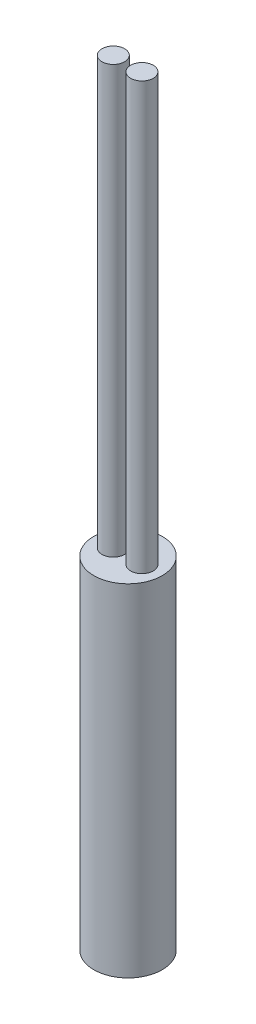
ISO-10303-21;
HEADER;
FILE_DESCRIPTION(('STEP AP214'),'2;1');
FILE_NAME('part.step','',(''),(''),'','','');
FILE_SCHEMA(('AUTOMOTIVE_DESIGN { 1 0 10303 214 1 1 1 1 }'));
ENDSEC;
DATA;
#1=APPLICATION_CONTEXT('core data for automotive mechanical design processes');
#2=APPLICATION_PROTOCOL_DEFINITION('international standard','automotive_design',2000,#1);
#3=PRODUCT_CONTEXT('',#1,'mechanical');
#4=PRODUCT('Part','Part','',(#3));
#5=PRODUCT_RELATED_PRODUCT_CATEGORY('part','',(#4));
#6=PRODUCT_DEFINITION_FORMATION('','',#4);
#7=PRODUCT_DEFINITION_CONTEXT('part definition',#1,'design');
#8=PRODUCT_DEFINITION('design','',#6,#7);
#9=PRODUCT_DEFINITION_SHAPE('','',#8);
#10=(LENGTH_UNIT() NAMED_UNIT(*) SI_UNIT(.MILLI.,.METRE.));
#11=(NAMED_UNIT(*) PLANE_ANGLE_UNIT() SI_UNIT($,.RADIAN.));
#12=(NAMED_UNIT(*) SI_UNIT($,.STERADIAN.) SOLID_ANGLE_UNIT());
#13=UNCERTAINTY_MEASURE_WITH_UNIT(LENGTH_MEASURE(1.E-05),#10,'distance_accuracy_value','');
#14=(GEOMETRIC_REPRESENTATION_CONTEXT(3) GLOBAL_UNCERTAINTY_ASSIGNED_CONTEXT((#13)) GLOBAL_UNIT_ASSIGNED_CONTEXT((#10,
#11,#12)) REPRESENTATION_CONTEXT('',''));
#15=CARTESIAN_POINT('',(0.,0.,0.));
#16=DIRECTION('',(0.,0.,1.));
#17=DIRECTION('',(1.,0.,0.));
#18=AXIS2_PLACEMENT_3D('',#15,#16,#17);
#19=CARTESIAN_POINT('',(0.,80.,0.));
#20=DIRECTION('',(0.,1.,0.));
#21=DIRECTION('',(0.,0.,1.));
#22=AXIS2_PLACEMENT_3D('',#19,#20,#21);
#23=PLANE('',#22);
#24=CARTESIAN_POINT('',(-3.35487727921084,80.,0.0901032740918996));
#25=DIRECTION('',(0.,1.,0.));
#26=DIRECTION('',(0.,0.,1.));
#27=AXIS2_PLACEMENT_3D('',#24,#25,#26);
#28=CIRCLE('',#27,2.64975220874494);
#29=CARTESIAN_POINT('',(-3.35487727921084,80.,-2.55964893465304));
#30=VERTEX_POINT('',#29);
#31=EDGE_CURVE('E10',#30,#30,#28,.T.);
#32=ORIENTED_EDGE('',*,*,#31,.F.);
#33=EDGE_LOOP('',(#32));
#34=FACE_BOUND('',#33,.T.);
#35=CARTESIAN_POINT('',(3.35487727921084,80.,0.0901032740918996));
#36=DIRECTION('',(0.,1.,0.));
#37=DIRECTION('',(0.,0.,1.));
#38=AXIS2_PLACEMENT_3D('',#35,#36,#37);
#39=CIRCLE('',#38,2.64975220874494);
#40=CARTESIAN_POINT('',(3.35487727921084,80.,-2.55964893465304));
#41=VERTEX_POINT('',#40);
#42=EDGE_CURVE('E60',#41,#41,#39,.T.);
#43=ORIENTED_EDGE('',*,*,#42,.F.);
#44=EDGE_LOOP('',(#43));
#45=FACE_BOUND('',#44,.T.);
#46=CARTESIAN_POINT('',(0.,80.,0.));
#47=DIRECTION('',(0.,1.,0.));
#48=DIRECTION('',(0.,0.,1.));
#49=AXIS2_PLACEMENT_3D('',#46,#47,#48);
#50=CIRCLE('',#49,8.);
#51=CARTESIAN_POINT('',(0.,80.,-8.));
#52=VERTEX_POINT('',#51);
#53=EDGE_CURVE('E65',#52,#52,#50,.T.);
#54=ORIENTED_EDGE('',*,*,#53,.T.);
#55=EDGE_LOOP('',(#54));
#56=FACE_BOUND('',#55,.T.);
#57=ADVANCED_FACE('F42',(#34,#45,#56),#23,.T.);
#58=CARTESIAN_POINT('',(-3.35487727921084,180.,0.0901032740918996));
#59=DIRECTION('',(0.,-1.,0.));
#60=DIRECTION('',(0.,0.,-1.));
#61=AXIS2_PLACEMENT_3D('',#58,#59,#60);
#62=CYLINDRICAL_SURFACE('',#61,2.64975220874494);
#63=CARTESIAN_POINT('',(-3.35487727921084,180.,0.0901032740918996));
#64=DIRECTION('',(0.,1.,0.));
#65=DIRECTION('',(0.,0.,1.));
#66=AXIS2_PLACEMENT_3D('',#63,#64,#65);
#67=CIRCLE('',#66,2.64975220874494);
#68=CARTESIAN_POINT('',(-3.35487727921084,180.,-2.55964893465304));
#69=VERTEX_POINT('',#68);
#70=EDGE_CURVE('E50',#69,#69,#67,.F.);
#71=CARTESIAN_POINT('',(-3.35487727921084,180.,-2.55964893465304));
#72=CARTESIAN_POINT('',(-3.35487727921084,178.958333333333,-2.55964893465304));
#73=CARTESIAN_POINT('',(-3.35487727921084,177.916666666667,-2.55964893465304));
#74=CARTESIAN_POINT('',(-3.35487727921084,175.833333333333,-2.55964893465304));
#75=CARTESIAN_POINT('',(-3.35487727921084,174.791666666667,-2.55964893465304));
#76=CARTESIAN_POINT('',(-3.35487727921084,172.708333333333,-2.55964893465304));
#77=CARTESIAN_POINT('',(-3.35487727921084,171.666666666667,-2.55964893465304));
#78=CARTESIAN_POINT('',(-3.35487727921084,169.583333333333,-2.55964893465304));
#79=CARTESIAN_POINT('',(-3.35487727921084,168.541666666667,-2.55964893465304));
#80=CARTESIAN_POINT('',(-3.35487727921084,166.458333333333,-2.55964893465304));
#81=CARTESIAN_POINT('',(-3.35487727921084,165.416666666667,-2.55964893465304));
#82=CARTESIAN_POINT('',(-3.35487727921084,163.333333333333,-2.55964893465304));
#83=CARTESIAN_POINT('',(-3.35487727921084,162.291666666667,-2.55964893465304));
#84=CARTESIAN_POINT('',(-3.35487727921084,160.208333333333,-2.55964893465304));
#85=CARTESIAN_POINT('',(-3.35487727921084,159.166666666667,-2.55964893465304));
#86=CARTESIAN_POINT('',(-3.35487727921084,157.083333333333,-2.55964893465304));
#87=CARTESIAN_POINT('',(-3.35487727921084,156.041666666667,-2.55964893465304));
#88=CARTESIAN_POINT('',(-3.35487727921084,153.958333333333,-2.55964893465304));
#89=CARTESIAN_POINT('',(-3.35487727921084,152.916666666667,-2.55964893465304));
#90=CARTESIAN_POINT('',(-3.35487727921084,150.833333333333,-2.55964893465304));
#91=CARTESIAN_POINT('',(-3.35487727921084,149.791666666667,-2.55964893465304));
#92=CARTESIAN_POINT('',(-3.35487727921084,147.708333333333,-2.55964893465304));
#93=CARTESIAN_POINT('',(-3.35487727921084,146.666666666667,-2.55964893465304));
#94=CARTESIAN_POINT('',(-3.35487727921084,144.583333333333,-2.55964893465304));
#95=CARTESIAN_POINT('',(-3.35487727921084,143.541666666667,-2.55964893465304));
#96=CARTESIAN_POINT('',(-3.35487727921084,141.458333333333,-2.55964893465304));
#97=CARTESIAN_POINT('',(-3.35487727921084,140.416666666667,-2.55964893465304));
#98=CARTESIAN_POINT('',(-3.35487727921084,138.333333333333,-2.55964893465304));
#99=CARTESIAN_POINT('',(-3.35487727921084,137.291666666667,-2.55964893465304));
#100=CARTESIAN_POINT('',(-3.35487727921084,135.208333333333,-2.55964893465304));
#101=CARTESIAN_POINT('',(-3.35487727921084,134.166666666667,-2.55964893465304));
#102=CARTESIAN_POINT('',(-3.35487727921084,132.083333333333,-2.55964893465304));
#103=CARTESIAN_POINT('',(-3.35487727921084,131.041666666667,-2.55964893465304));
#104=CARTESIAN_POINT('',(-3.35487727921084,128.958333333333,-2.55964893465304));
#105=CARTESIAN_POINT('',(-3.35487727921084,127.916666666667,-2.55964893465304));
#106=CARTESIAN_POINT('',(-3.35487727921084,125.833333333333,-2.55964893465304));
#107=CARTESIAN_POINT('',(-3.35487727921084,124.791666666667,-2.55964893465304));
#108=CARTESIAN_POINT('',(-3.35487727921084,122.708333333333,-2.55964893465304));
#109=CARTESIAN_POINT('',(-3.35487727921084,121.666666666667,-2.55964893465304));
#110=CARTESIAN_POINT('',(-3.35487727921084,119.583333333333,-2.55964893465304));
#111=CARTESIAN_POINT('',(-3.35487727921084,118.541666666667,-2.55964893465304));
#112=CARTESIAN_POINT('',(-3.35487727921084,116.458333333333,-2.55964893465304));
#113=CARTESIAN_POINT('',(-3.35487727921084,115.416666666667,-2.55964893465304));
#114=CARTESIAN_POINT('',(-3.35487727921084,113.333333333333,-2.55964893465304));
#115=CARTESIAN_POINT('',(-3.35487727921084,112.291666666667,-2.55964893465304));
#116=CARTESIAN_POINT('',(-3.35487727921084,110.208333333333,-2.55964893465304));
#117=CARTESIAN_POINT('',(-3.35487727921084,109.166666666667,-2.55964893465304));
#118=CARTESIAN_POINT('',(-3.35487727921084,107.083333333333,-2.55964893465304));
#119=CARTESIAN_POINT('',(-3.35487727921084,106.041666666667,-2.55964893465304));
#120=CARTESIAN_POINT('',(-3.35487727921084,103.958333333333,-2.55964893465304));
#121=CARTESIAN_POINT('',(-3.35487727921084,102.916666666667,-2.55964893465304));
#122=CARTESIAN_POINT('',(-3.35487727921084,100.833333333333,-2.55964893465304));
#123=CARTESIAN_POINT('',(-3.35487727921084,99.7916666666667,-2.55964893465304));
#124=CARTESIAN_POINT('',(-3.35487727921084,97.7083333333333,-2.55964893465304));
#125=CARTESIAN_POINT('',(-3.35487727921084,96.6666666666667,-2.55964893465304));
#126=CARTESIAN_POINT('',(-3.35487727921084,94.5833333333333,-2.55964893465304));
#127=CARTESIAN_POINT('',(-3.35487727921084,93.5416666666667,-2.55964893465304));
#128=CARTESIAN_POINT('',(-3.35487727921084,91.4583333333333,-2.55964893465304));
#129=CARTESIAN_POINT('',(-3.35487727921084,90.4166666666667,-2.55964893465304));
#130=CARTESIAN_POINT('',(-3.35487727921084,88.3333333333333,-2.55964893465304));
#131=CARTESIAN_POINT('',(-3.35487727921084,87.2916666666667,-2.55964893465304));
#132=CARTESIAN_POINT('',(-3.35487727921084,85.2083333333333,-2.55964893465304));
#133=CARTESIAN_POINT('',(-3.35487727921084,84.1666666666667,-2.55964893465304));
#134=CARTESIAN_POINT('',(-3.35487727921084,82.0833333333333,-2.55964893465304));
#135=CARTESIAN_POINT('',(-3.35487727921084,81.0416666666667,-2.55964893465304));
#136=CARTESIAN_POINT('',(-3.35487727921084,80.,-2.55964893465304));
#137=B_SPLINE_CURVE_WITH_KNOTS('',3,(#71,#72,#73,#74,#75,#76,#77,#78,#79,#80,#81,#82,#83,#84,
#85,#86,#87,#88,#89,#90,#91,#92,#93,#94,#95,#96,#97,#98,#99,#100,#101,#102,#103,#104,#105,#106,
#107,#108,#109,#110,#111,#112,#113,#114,#115,#116,#117,#118,#119,#120,#121,#122,#123,#124,#125,
#126,#127,#128,#129,#130,#131,#132,#133,#134,#135,#136),.UNSPECIFIED.,.F.,.F.,(4,2,2,2,2,2,2,2,
2,2,2,2,2,2,2,2,2,2,2,2,2,2,2,2,2,2,2,2,2,2,2,2,4),(0.,3.12500000000002,6.25000000000001,
9.37500000000002,12.5,15.625,18.75,21.875,25.,28.125,31.25,34.375,37.5,40.625,43.75,46.875,50.,
53.125,56.25,59.375,62.5,65.625,68.75,71.875,75.,78.125,81.25,84.375,87.5,90.625,93.75,96.875,
100.),.UNSPECIFIED.);
#138=EDGE_CURVE('BSEAM91',#69,#30,#137,.T.);
#139=ORIENTED_EDGE('',*,*,#70,.T.);
#140=ORIENTED_EDGE('',*,*,#31,.T.);
#141=ORIENTED_EDGE('',*,*,#138,.T.);
#142=ORIENTED_EDGE('',*,*,#138,.F.);
#143=EDGE_LOOP('',(#139,#141,#140,#142));
#144=FACE_BOUND('',#143,.T.);
#145=ADVANCED_FACE('F91',(#144),#62,.T.);
#146=CARTESIAN_POINT('',(0.,180.,0.));
#147=DIRECTION('',(0.,1.,0.));
#148=DIRECTION('',(0.,0.,1.));
#149=AXIS2_PLACEMENT_3D('',#146,#147,#148);
#150=PLANE('',#149);
#151=ORIENTED_EDGE('',*,*,#70,.F.);
#152=EDGE_LOOP('',(#151));
#153=FACE_BOUND('',#152,.T.);
#154=ADVANCED_FACE('F97',(#153),#150,.T.);
#155=CARTESIAN_POINT('',(3.35487727921084,180.,0.0901032740918996));
#156=DIRECTION('',(0.,-1.,0.));
#157=DIRECTION('',(0.,0.,-1.));
#158=AXIS2_PLACEMENT_3D('',#155,#156,#157);
#159=CYLINDRICAL_SURFACE('',#158,2.64975220874494);
#160=CARTESIAN_POINT('',(3.35487727921084,180.,0.0901032740918996));
#161=DIRECTION('',(0.,1.,0.));
#162=DIRECTION('',(0.,0.,1.));
#163=AXIS2_PLACEMENT_3D('',#160,#161,#162);
#164=CIRCLE('',#163,2.64975220874494);
#165=CARTESIAN_POINT('',(3.35487727921084,180.,-2.55964893465304));
#166=VERTEX_POINT('',#165);
#167=EDGE_CURVE('E55',#166,#166,#164,.T.);
#168=CARTESIAN_POINT('',(3.35487727921084,180.,-2.55964893465304));
#169=CARTESIAN_POINT('',(3.35487727921084,178.958333333333,-2.55964893465304));
#170=CARTESIAN_POINT('',(3.35487727921084,177.916666666667,-2.55964893465304));
#171=CARTESIAN_POINT('',(3.35487727921084,175.833333333333,-2.55964893465304));
#172=CARTESIAN_POINT('',(3.35487727921084,174.791666666667,-2.55964893465304));
#173=CARTESIAN_POINT('',(3.35487727921084,172.708333333333,-2.55964893465304));
#174=CARTESIAN_POINT('',(3.35487727921084,171.666666666667,-2.55964893465304));
#175=CARTESIAN_POINT('',(3.35487727921084,169.583333333333,-2.55964893465304));
#176=CARTESIAN_POINT('',(3.35487727921084,168.541666666667,-2.55964893465304));
#177=CARTESIAN_POINT('',(3.35487727921084,166.458333333333,-2.55964893465304));
#178=CARTESIAN_POINT('',(3.35487727921084,165.416666666667,-2.55964893465304));
#179=CARTESIAN_POINT('',(3.35487727921084,163.333333333333,-2.55964893465304));
#180=CARTESIAN_POINT('',(3.35487727921084,162.291666666667,-2.55964893465304));
#181=CARTESIAN_POINT('',(3.35487727921084,160.208333333333,-2.55964893465304));
#182=CARTESIAN_POINT('',(3.35487727921084,159.166666666667,-2.55964893465304));
#183=CARTESIAN_POINT('',(3.35487727921084,157.083333333333,-2.55964893465304));
#184=CARTESIAN_POINT('',(3.35487727921084,156.041666666667,-2.55964893465304));
#185=CARTESIAN_POINT('',(3.35487727921084,153.958333333333,-2.55964893465304));
#186=CARTESIAN_POINT('',(3.35487727921084,152.916666666667,-2.55964893465304));
#187=CARTESIAN_POINT('',(3.35487727921084,150.833333333333,-2.55964893465304));
#188=CARTESIAN_POINT('',(3.35487727921084,149.791666666667,-2.55964893465304));
#189=CARTESIAN_POINT('',(3.35487727921084,147.708333333333,-2.55964893465304));
#190=CARTESIAN_POINT('',(3.35487727921084,146.666666666667,-2.55964893465304));
#191=CARTESIAN_POINT('',(3.35487727921084,144.583333333333,-2.55964893465304));
#192=CARTESIAN_POINT('',(3.35487727921084,143.541666666667,-2.55964893465304));
#193=CARTESIAN_POINT('',(3.35487727921084,141.458333333333,-2.55964893465304));
#194=CARTESIAN_POINT('',(3.35487727921084,140.416666666667,-2.55964893465304));
#195=CARTESIAN_POINT('',(3.35487727921084,138.333333333333,-2.55964893465304));
#196=CARTESIAN_POINT('',(3.35487727921084,137.291666666667,-2.55964893465304));
#197=CARTESIAN_POINT('',(3.35487727921084,135.208333333333,-2.55964893465304));
#198=CARTESIAN_POINT('',(3.35487727921084,134.166666666667,-2.55964893465304));
#199=CARTESIAN_POINT('',(3.35487727921084,132.083333333333,-2.55964893465304));
#200=CARTESIAN_POINT('',(3.35487727921084,131.041666666667,-2.55964893465304));
#201=CARTESIAN_POINT('',(3.35487727921084,128.958333333333,-2.55964893465304));
#202=CARTESIAN_POINT('',(3.35487727921084,127.916666666667,-2.55964893465304));
#203=CARTESIAN_POINT('',(3.35487727921084,125.833333333333,-2.55964893465304));
#204=CARTESIAN_POINT('',(3.35487727921084,124.791666666667,-2.55964893465304));
#205=CARTESIAN_POINT('',(3.35487727921084,122.708333333333,-2.55964893465304));
#206=CARTESIAN_POINT('',(3.35487727921084,121.666666666667,-2.55964893465304));
#207=CARTESIAN_POINT('',(3.35487727921084,119.583333333333,-2.55964893465304));
#208=CARTESIAN_POINT('',(3.35487727921084,118.541666666667,-2.55964893465304));
#209=CARTESIAN_POINT('',(3.35487727921084,116.458333333333,-2.55964893465304));
#210=CARTESIAN_POINT('',(3.35487727921084,115.416666666667,-2.55964893465304));
#211=CARTESIAN_POINT('',(3.35487727921084,113.333333333333,-2.55964893465304));
#212=CARTESIAN_POINT('',(3.35487727921084,112.291666666667,-2.55964893465304));
#213=CARTESIAN_POINT('',(3.35487727921084,110.208333333333,-2.55964893465304));
#214=CARTESIAN_POINT('',(3.35487727921084,109.166666666667,-2.55964893465304));
#215=CARTESIAN_POINT('',(3.35487727921084,107.083333333333,-2.55964893465304));
#216=CARTESIAN_POINT('',(3.35487727921084,106.041666666667,-2.55964893465304));
#217=CARTESIAN_POINT('',(3.35487727921084,103.958333333333,-2.55964893465304));
#218=CARTESIAN_POINT('',(3.35487727921084,102.916666666667,-2.55964893465304));
#219=CARTESIAN_POINT('',(3.35487727921084,100.833333333333,-2.55964893465304));
#220=CARTESIAN_POINT('',(3.35487727921084,99.7916666666667,-2.55964893465304));
#221=CARTESIAN_POINT('',(3.35487727921084,97.7083333333333,-2.55964893465304));
#222=CARTESIAN_POINT('',(3.35487727921084,96.6666666666667,-2.55964893465304));
#223=CARTESIAN_POINT('',(3.35487727921084,94.5833333333333,-2.55964893465304));
#224=CARTESIAN_POINT('',(3.35487727921084,93.5416666666667,-2.55964893465304));
#225=CARTESIAN_POINT('',(3.35487727921084,91.4583333333333,-2.55964893465304));
#226=CARTESIAN_POINT('',(3.35487727921084,90.4166666666667,-2.55964893465304));
#227=CARTESIAN_POINT('',(3.35487727921084,88.3333333333333,-2.55964893465304));
#228=CARTESIAN_POINT('',(3.35487727921084,87.2916666666667,-2.55964893465304));
#229=CARTESIAN_POINT('',(3.35487727921084,85.2083333333333,-2.55964893465304));
#230=CARTESIAN_POINT('',(3.35487727921084,84.1666666666667,-2.55964893465304));
#231=CARTESIAN_POINT('',(3.35487727921084,82.0833333333333,-2.55964893465304));
#232=CARTESIAN_POINT('',(3.35487727921084,81.0416666666667,-2.55964893465304));
#233=CARTESIAN_POINT('',(3.35487727921084,80.,-2.55964893465304));
#234=B_SPLINE_CURVE_WITH_KNOTS('',3,(#168,#169,#170,#171,#172,#173,#174,#175,#176,#177,#178,
#179,#180,#181,#182,#183,#184,#185,#186,#187,#188,#189,#190,#191,#192,#193,#194,#195,#196,#197,
#198,#199,#200,#201,#202,#203,#204,#205,#206,#207,#208,#209,#210,#211,#212,#213,#214,#215,#216,
#217,#218,#219,#220,#221,#222,#223,#224,#225,#226,#227,#228,#229,#230,#231,#232,#233),
.UNSPECIFIED.,.F.,.F.,(4,2,2,2,2,2,2,2,2,2,2,2,2,2,2,2,2,2,2,2,2,2,2,2,2,2,2,2,2,2,2,2,4),(0.,
3.12500000000002,6.25000000000001,9.37500000000002,12.5,15.625,18.75,21.875,25.,28.125,31.25,
34.375,37.5,40.625,43.75,46.875,50.,53.125,56.25,59.375,62.5,65.625,68.75,71.875,75.,78.125,
81.25,84.375,87.5,90.625,93.75,96.875,100.),.UNSPECIFIED.);
#235=EDGE_CURVE('BSEAM86',#166,#41,#234,.T.);
#236=ORIENTED_EDGE('',*,*,#167,.F.);
#237=ORIENTED_EDGE('',*,*,#42,.T.);
#238=ORIENTED_EDGE('',*,*,#235,.T.);
#239=ORIENTED_EDGE('',*,*,#235,.F.);
#240=EDGE_LOOP('',(#236,#238,#237,#239));
#241=FACE_BOUND('',#240,.T.);
#242=ADVANCED_FACE('F86',(#241),#159,.T.);
#243=CARTESIAN_POINT('',(0.,180.,0.));
#244=DIRECTION('',(0.,1.,0.));
#245=DIRECTION('',(0.,0.,1.));
#246=AXIS2_PLACEMENT_3D('',#243,#244,#245);
#247=PLANE('',#246);
#248=ORIENTED_EDGE('',*,*,#167,.T.);
#249=EDGE_LOOP('',(#248));
#250=FACE_BOUND('',#249,.T.);
#251=ADVANCED_FACE('F78',(#250),#247,.T.);
#252=CARTESIAN_POINT('',(0.,180.,0.));
#253=DIRECTION('',(0.,-1.,0.));
#254=DIRECTION('',(0.,0.,-1.));
#255=AXIS2_PLACEMENT_3D('',#252,#253,#254);
#256=CYLINDRICAL_SURFACE('',#255,8.);
#257=CARTESIAN_POINT('',(0.,0.,0.));
#258=DIRECTION('',(0.,-1.,0.));
#259=DIRECTION('',(0.,0.,-1.));
#260=AXIS2_PLACEMENT_3D('',#257,#258,#259);
#261=CIRCLE('',#260,8.);
#262=CARTESIAN_POINT('',(0.,0.,-8.));
#263=VERTEX_POINT('',#262);
#264=EDGE_CURVE('E70',#263,#263,#261,.T.);
#265=CARTESIAN_POINT('',(0.,80.,-8.));
#266=CARTESIAN_POINT('',(0.,79.1666666666667,-8.));
#267=CARTESIAN_POINT('',(0.,78.3333333333333,-8.));
#268=CARTESIAN_POINT('',(0.,76.6666666666667,-8.));
#269=CARTESIAN_POINT('',(0.,75.8333333333333,-8.));
#270=CARTESIAN_POINT('',(0.,74.1666666666667,-8.));
#271=CARTESIAN_POINT('',(0.,73.3333333333333,-8.));
#272=CARTESIAN_POINT('',(0.,71.6666666666667,-8.));
#273=CARTESIAN_POINT('',(0.,70.8333333333333,-8.));
#274=CARTESIAN_POINT('',(0.,69.1666666666667,-8.));
#275=CARTESIAN_POINT('',(0.,68.3333333333333,-8.));
#276=CARTESIAN_POINT('',(0.,66.6666666666667,-8.));
#277=CARTESIAN_POINT('',(0.,65.8333333333333,-8.));
#278=CARTESIAN_POINT('',(0.,64.1666666666667,-8.));
#279=CARTESIAN_POINT('',(0.,63.3333333333333,-8.));
#280=CARTESIAN_POINT('',(0.,61.6666666666667,-8.));
#281=CARTESIAN_POINT('',(0.,60.8333333333333,-8.));
#282=CARTESIAN_POINT('',(0.,59.1666666666667,-8.));
#283=CARTESIAN_POINT('',(0.,58.3333333333333,-8.));
#284=CARTESIAN_POINT('',(0.,56.6666666666667,-8.));
#285=CARTESIAN_POINT('',(0.,55.8333333333333,-8.));
#286=CARTESIAN_POINT('',(0.,54.1666666666667,-8.));
#287=CARTESIAN_POINT('',(0.,53.3333333333333,-8.));
#288=CARTESIAN_POINT('',(0.,51.6666666666667,-8.));
#289=CARTESIAN_POINT('',(0.,50.8333333333333,-8.));
#290=CARTESIAN_POINT('',(0.,49.1666666666667,-8.));
#291=CARTESIAN_POINT('',(0.,48.3333333333333,-8.));
#292=CARTESIAN_POINT('',(0.,46.6666666666667,-8.));
#293=CARTESIAN_POINT('',(0.,45.8333333333333,-8.));
#294=CARTESIAN_POINT('',(0.,44.1666666666667,-8.));
#295=CARTESIAN_POINT('',(0.,43.3333333333333,-8.));
#296=CARTESIAN_POINT('',(0.,41.6666666666667,-8.));
#297=CARTESIAN_POINT('',(0.,40.8333333333333,-8.));
#298=CARTESIAN_POINT('',(0.,39.1666666666667,-8.));
#299=CARTESIAN_POINT('',(0.,38.3333333333333,-8.));
#300=CARTESIAN_POINT('',(0.,36.6666666666667,-8.));
#301=CARTESIAN_POINT('',(0.,35.8333333333334,-8.));
#302=CARTESIAN_POINT('',(0.,34.1666666666667,-8.));
#303=CARTESIAN_POINT('',(0.,33.3333333333334,-8.));
#304=CARTESIAN_POINT('',(0.,31.6666666666667,-8.));
#305=CARTESIAN_POINT('',(0.,30.8333333333334,-8.));
#306=CARTESIAN_POINT('',(0.,29.1666666666667,-8.));
#307=CARTESIAN_POINT('',(0.,28.3333333333334,-8.));
#308=CARTESIAN_POINT('',(0.,26.6666666666667,-8.));
#309=CARTESIAN_POINT('',(0.,25.8333333333334,-8.));
#310=CARTESIAN_POINT('',(0.,24.1666666666667,-8.));
#311=CARTESIAN_POINT('',(0.,23.3333333333334,-8.));
#312=CARTESIAN_POINT('',(0.,21.6666666666667,-8.));
#313=CARTESIAN_POINT('',(0.,20.8333333333334,-8.));
#314=CARTESIAN_POINT('',(0.,19.1666666666667,-8.));
#315=CARTESIAN_POINT('',(0.,18.3333333333333,-8.));
#316=CARTESIAN_POINT('',(0.,16.6666666666667,-8.));
#317=CARTESIAN_POINT('',(0.,15.8333333333334,-8.));
#318=CARTESIAN_POINT('',(0.,14.1666666666667,-8.));
#319=CARTESIAN_POINT('',(0.,13.3333333333334,-8.));
#320=CARTESIAN_POINT('',(0.,11.6666666666667,-8.));
#321=CARTESIAN_POINT('',(0.,10.8333333333334,-8.));
#322=CARTESIAN_POINT('',(0.,9.1666666666667,-8.));
#323=CARTESIAN_POINT('',(0.,8.33333333333337,-8.));
#324=CARTESIAN_POINT('',(0.,6.6666666666667,-8.));
#325=CARTESIAN_POINT('',(0.,5.83333333333337,-8.));
#326=CARTESIAN_POINT('',(0.,4.1666666666667,-8.));
#327=CARTESIAN_POINT('',(0.,3.33333333333336,-8.));
#328=CARTESIAN_POINT('',(0.,1.6666666666667,-8.));
#329=CARTESIAN_POINT('',(0.,0.833333333333363,-8.));
#330=CARTESIAN_POINT('',(0.,0.,-8.));
#331=B_SPLINE_CURVE_WITH_KNOTS('',3,(#265,#266,#267,#268,#269,#270,#271,#272,#273,#274,#275,
#276,#277,#278,#279,#280,#281,#282,#283,#284,#285,#286,#287,#288,#289,#290,#291,#292,#293,#294,
#295,#296,#297,#298,#299,#300,#301,#302,#303,#304,#305,#306,#307,#308,#309,#310,#311,#312,#313,
#314,#315,#316,#317,#318,#319,#320,#321,#322,#323,#324,#325,#326,#327,#328,#329,#330),
.UNSPECIFIED.,.F.,.F.,(4,2,2,2,2,2,2,2,2,2,2,2,2,2,2,2,2,2,2,2,2,2,2,2,2,2,2,2,2,2,2,2,4),(0.,
2.5,5.,7.49999999999999,9.99999999999999,12.5,15.,17.5,20.,22.5,25.,27.5,30.,32.5,35.,37.5,40.,
42.5,45.,47.5,50.,52.5,55.,57.5,60.,62.5,65.,67.5,70.,72.5,75.,77.5,80.),.UNSPECIFIED.);
#332=EDGE_CURVE('BSEAM76',#52,#263,#331,.T.);
#333=ORIENTED_EDGE('',*,*,#53,.F.);
#334=ORIENTED_EDGE('',*,*,#264,.F.);
#335=ORIENTED_EDGE('',*,*,#332,.T.);
#336=ORIENTED_EDGE('',*,*,#332,.F.);
#337=EDGE_LOOP('',(#333,#335,#334,#336));
#338=FACE_BOUND('',#337,.T.);
#339=ADVANCED_FACE('F76',(#338),#256,.T.);
#340=CARTESIAN_POINT('',(0.,0.,0.));
#341=DIRECTION('',(0.,1.,0.));
#342=DIRECTION('',(0.,0.,1.));
#343=AXIS2_PLACEMENT_3D('',#340,#341,#342);
#344=PLANE('',#343);
#345=ORIENTED_EDGE('',*,*,#264,.T.);
#346=EDGE_LOOP('',(#345));
#347=FACE_BOUND('',#346,.T.);
#348=ADVANCED_FACE('F44',(#347),#344,.F.);
#349=CLOSED_SHELL('',(#57,#145,#154,#242,#251,#339,#348));
#350=MANIFOLD_SOLID_BREP('B2',#349);
#351=ADVANCED_BREP_SHAPE_REPRESENTATION('',(#18,#350),#14);
#352=SHAPE_DEFINITION_REPRESENTATION(#9,#351);
ENDSEC;
END-ISO-10303-21;
